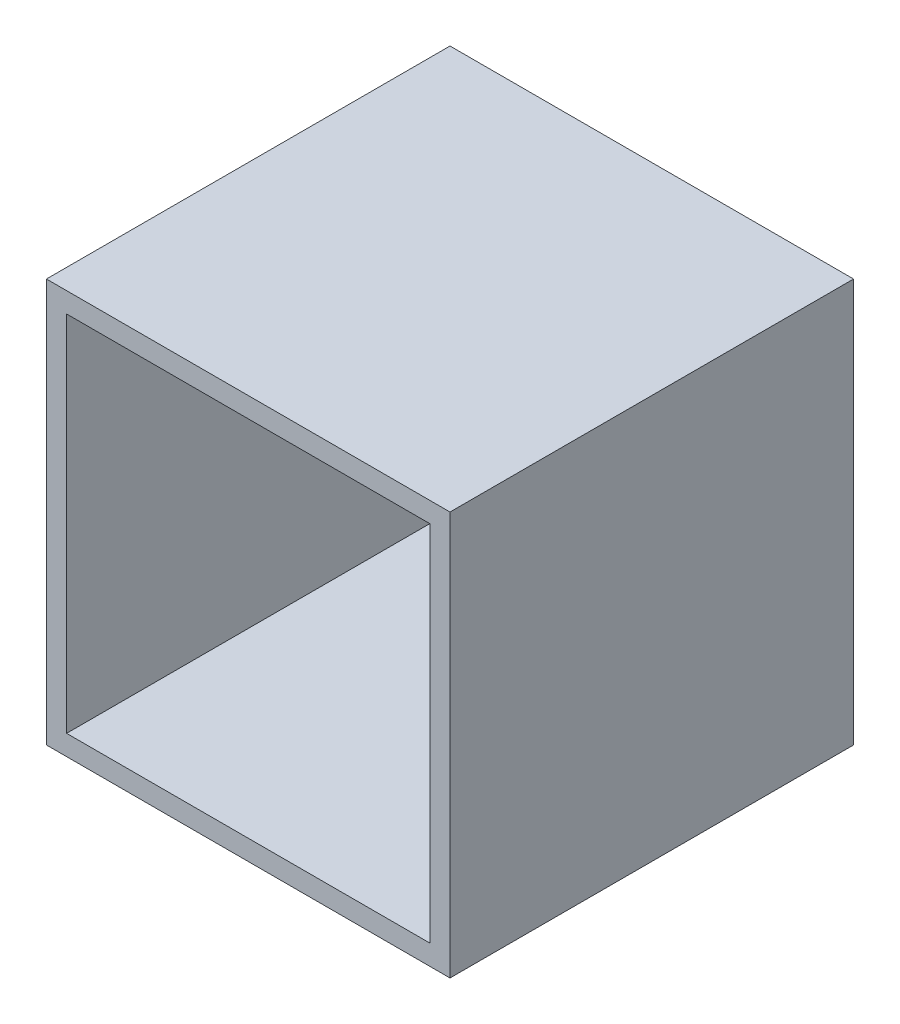
ISO-10303-21;
HEADER;
FILE_DESCRIPTION(('STEP AP214'),'2;1');
FILE_NAME('part.step','',(''),(''),'','','');
FILE_SCHEMA(('AUTOMOTIVE_DESIGN { 1 0 10303 214 1 1 1 1 }'));
ENDSEC;
DATA;
#1=APPLICATION_CONTEXT('core data for automotive mechanical design processes');
#2=APPLICATION_PROTOCOL_DEFINITION('international standard','automotive_design',2000,#1);
#3=PRODUCT_CONTEXT('',#1,'mechanical');
#4=PRODUCT('Part','Part','',(#3));
#5=PRODUCT_RELATED_PRODUCT_CATEGORY('part','',(#4));
#6=PRODUCT_DEFINITION_FORMATION('','',#4);
#7=PRODUCT_DEFINITION_CONTEXT('part definition',#1,'design');
#8=PRODUCT_DEFINITION('design','',#6,#7);
#9=PRODUCT_DEFINITION_SHAPE('','',#8);
#10=(LENGTH_UNIT() NAMED_UNIT(*) SI_UNIT(.MILLI.,.METRE.));
#11=(NAMED_UNIT(*) PLANE_ANGLE_UNIT() SI_UNIT($,.RADIAN.));
#12=(NAMED_UNIT(*) SI_UNIT($,.STERADIAN.) SOLID_ANGLE_UNIT());
#13=UNCERTAINTY_MEASURE_WITH_UNIT(LENGTH_MEASURE(1.E-05),#10,'distance_accuracy_value','');
#14=(GEOMETRIC_REPRESENTATION_CONTEXT(3) GLOBAL_UNCERTAINTY_ASSIGNED_CONTEXT((#13)) GLOBAL_UNIT_ASSIGNED_CONTEXT((#10,
#11,#12)) REPRESENTATION_CONTEXT('',''));
#15=CARTESIAN_POINT('',(0.,0.,0.));
#16=DIRECTION('',(0.,0.,1.));
#17=DIRECTION('',(1.,0.,0.));
#18=AXIS2_PLACEMENT_3D('',#15,#16,#17);
#19=CARTESIAN_POINT('',(-48.1313131313131,27.2727272727273,100.));
#20=DIRECTION('',(1.,0.,0.));
#21=DIRECTION('',(0.,1.,0.));
#22=AXIS2_PLACEMENT_3D('',#19,#20,#21);
#23=PLANE('',#22);
#24=DIRECTION('',(0.,-1.,0.));
#25=VECTOR('',#24,1.);
#26=CARTESIAN_POINT('',(-48.1313131313131,27.2727272727273,0.));
#27=LINE('',#26,#25);
#28=CARTESIAN_POINT('',(-48.1313131313131,27.2727272727273,0.));
#29=VERTEX_POINT('',#28);
#30=CARTESIAN_POINT('',(-48.1313131313131,-72.7272727272727,0.));
#31=VERTEX_POINT('',#30);
#32=EDGE_CURVE('E156',#29,#31,#27,.T.);
#33=ORIENTED_EDGE('',*,*,#32,.T.);
#34=DIRECTION('',(0.,0.,-1.));
#35=VECTOR('',#34,1.);
#36=CARTESIAN_POINT('',(-48.1313131313131,-72.7272727272727,100.));
#37=LINE('',#36,#35);
#38=CARTESIAN_POINT('',(-48.1313131313131,-72.7272727272727,100.));
#39=VERTEX_POINT('',#38);
#40=EDGE_CURVE('E11',#39,#31,#37,.T.);
#41=ORIENTED_EDGE('',*,*,#40,.F.);
#42=DIRECTION('',(0.,-1.,0.));
#43=VECTOR('',#42,1.);
#44=CARTESIAN_POINT('',(-48.1313131313131,27.2727272727273,100.));
#45=LINE('',#44,#43);
#46=CARTESIAN_POINT('',(-48.1313131313131,27.2727272727273,100.));
#47=VERTEX_POINT('',#46);
#48=EDGE_CURVE('E147',#47,#39,#45,.T.);
#49=ORIENTED_EDGE('',*,*,#48,.F.);
#50=DIRECTION('',(0.,0.,-1.));
#51=VECTOR('',#50,1.);
#52=CARTESIAN_POINT('',(-48.1313131313131,27.2727272727273,100.));
#53=LINE('',#52,#51);
#54=EDGE_CURVE('E62',#47,#29,#53,.T.);
#55=ORIENTED_EDGE('',*,*,#54,.T.);
#56=EDGE_LOOP('',(#33,#41,#49,#55));
#57=FACE_BOUND('',#56,.T.);
#58=ADVANCED_FACE('F39',(#57),#23,.F.);
#59=CARTESIAN_POINT('',(-48.1313131313131,-72.7272727272727,100.));
#60=DIRECTION('',(0.,1.,0.));
#61=DIRECTION('',(0.,0.,1.));
#62=AXIS2_PLACEMENT_3D('',#59,#60,#61);
#63=PLANE('',#62);
#64=DIRECTION('',(1.,0.,0.));
#65=VECTOR('',#64,1.);
#66=CARTESIAN_POINT('',(-48.1313131313131,-72.7272727272727,0.));
#67=LINE('',#66,#65);
#68=CARTESIAN_POINT('',(51.8686868686869,-72.7272727272727,0.));
#69=VERTEX_POINT('',#68);
#70=EDGE_CURVE('E158',#31,#69,#67,.T.);
#71=ORIENTED_EDGE('',*,*,#70,.T.);
#72=DIRECTION('',(0.,0.,-1.));
#73=VECTOR('',#72,1.);
#74=CARTESIAN_POINT('',(51.8686868686869,-72.7272727272727,100.));
#75=LINE('',#74,#73);
#76=CARTESIAN_POINT('',(51.8686868686869,-72.7272727272727,100.));
#77=VERTEX_POINT('',#76);
#78=EDGE_CURVE('E46',#77,#69,#75,.T.);
#79=ORIENTED_EDGE('',*,*,#78,.F.);
#80=DIRECTION('',(1.,0.,0.));
#81=VECTOR('',#80,1.);
#82=CARTESIAN_POINT('',(-48.1313131313131,-72.7272727272727,100.));
#83=LINE('',#82,#81);
#84=EDGE_CURVE('E88',#39,#77,#83,.T.);
#85=ORIENTED_EDGE('',*,*,#84,.F.);
#86=ORIENTED_EDGE('',*,*,#40,.T.);
#87=EDGE_LOOP('',(#71,#79,#85,#86));
#88=FACE_BOUND('',#87,.T.);
#89=ADVANCED_FACE('F172',(#88),#63,.F.);
#90=CARTESIAN_POINT('',(51.8686868686869,27.2727272727273,100.));
#91=DIRECTION('',(1.,0.,0.));
#92=DIRECTION('',(0.,1.,0.));
#93=AXIS2_PLACEMENT_3D('',#90,#91,#92);
#94=PLANE('',#93);
#95=DIRECTION('',(0.,-1.,0.));
#96=VECTOR('',#95,1.);
#97=CARTESIAN_POINT('',(51.8686868686869,27.2727272727273,0.));
#98=LINE('',#97,#96);
#99=CARTESIAN_POINT('',(51.8686868686869,27.2727272727273,0.));
#100=VERTEX_POINT('',#99);
#101=EDGE_CURVE('E161',#100,#69,#98,.T.);
#102=ORIENTED_EDGE('',*,*,#101,.F.);
#103=DIRECTION('',(0.,0.,-1.));
#104=VECTOR('',#103,1.);
#105=CARTESIAN_POINT('',(51.8686868686869,27.2727272727273,100.));
#106=LINE('',#105,#104);
#107=CARTESIAN_POINT('',(51.8686868686869,27.2727272727273,100.));
#108=VERTEX_POINT('',#107);
#109=EDGE_CURVE('E167',#108,#100,#106,.T.);
#110=ORIENTED_EDGE('',*,*,#109,.F.);
#111=DIRECTION('',(0.,-1.,0.));
#112=VECTOR('',#111,1.);
#113=CARTESIAN_POINT('',(51.8686868686869,27.2727272727273,100.));
#114=LINE('',#113,#112);
#115=EDGE_CURVE('E151',#108,#77,#114,.T.);
#116=ORIENTED_EDGE('',*,*,#115,.T.);
#117=ORIENTED_EDGE('',*,*,#78,.T.);
#118=EDGE_LOOP('',(#102,#110,#116,#117));
#119=FACE_BOUND('',#118,.T.);
#120=ADVANCED_FACE('F170',(#119),#94,.T.);
#121=CARTESIAN_POINT('',(-48.1313131313131,27.2727272727273,100.));
#122=DIRECTION('',(0.,1.,0.));
#123=DIRECTION('',(0.,0.,1.));
#124=AXIS2_PLACEMENT_3D('',#121,#122,#123);
#125=PLANE('',#124);
#126=DIRECTION('',(1.,0.,0.));
#127=VECTOR('',#126,1.);
#128=CARTESIAN_POINT('',(-48.1313131313131,27.2727272727273,0.));
#129=LINE('',#128,#127);
#130=EDGE_CURVE('E149',#29,#100,#129,.T.);
#131=ORIENTED_EDGE('',*,*,#130,.F.);
#132=ORIENTED_EDGE('',*,*,#54,.F.);
#133=DIRECTION('',(1.,0.,0.));
#134=VECTOR('',#133,1.);
#135=CARTESIAN_POINT('',(-48.1313131313131,27.2727272727273,100.));
#136=LINE('',#135,#134);
#137=EDGE_CURVE('E154',#47,#108,#136,.T.);
#138=ORIENTED_EDGE('',*,*,#137,.T.);
#139=ORIENTED_EDGE('',*,*,#109,.T.);
#140=EDGE_LOOP('',(#131,#132,#138,#139));
#141=FACE_BOUND('',#140,.T.);
#142=ADVANCED_FACE('F176',(#141),#125,.T.);
#143=CARTESIAN_POINT('',(0.,0.,100.));
#144=DIRECTION('',(0.,0.,1.));
#145=DIRECTION('',(1.,0.,0.));
#146=AXIS2_PLACEMENT_3D('',#143,#144,#145);
#147=PLANE('',#146);
#148=DIRECTION('',(0.,-1.,0.));
#149=VECTOR('',#148,1.);
#150=CARTESIAN_POINT('',(-43.1313131313131,27.2727272727273,100.));
#151=LINE('',#150,#149);
#152=CARTESIAN_POINT('',(-43.1313131313131,22.2727272727273,100.));
#153=VERTEX_POINT('',#152);
#154=CARTESIAN_POINT('',(-43.1313131313131,-67.7272727272727,100.));
#155=VERTEX_POINT('',#154);
#156=EDGE_CURVE('E137',#153,#155,#151,.T.);
#157=ORIENTED_EDGE('',*,*,#156,.F.);
#158=DIRECTION('',(1.,0.,0.));
#159=VECTOR('',#158,1.);
#160=CARTESIAN_POINT('',(-48.1313131313131,22.2727272727273,100.));
#161=LINE('',#160,#159);
#162=CARTESIAN_POINT('',(46.8686868686869,22.2727272727273,100.));
#163=VERTEX_POINT('',#162);
#164=EDGE_CURVE('E118',#153,#163,#161,.T.);
#165=ORIENTED_EDGE('',*,*,#164,.T.);
#166=DIRECTION('',(0.,-1.,0.));
#167=VECTOR('',#166,1.);
#168=CARTESIAN_POINT('',(46.8686868686869,27.2727272727273,100.));
#169=LINE('',#168,#167);
#170=CARTESIAN_POINT('',(46.8686868686869,-67.7272727272727,100.));
#171=VERTEX_POINT('',#170);
#172=EDGE_CURVE('E53',#163,#171,#169,.T.);
#173=ORIENTED_EDGE('',*,*,#172,.T.);
#174=DIRECTION('',(1.,0.,0.));
#175=VECTOR('',#174,1.);
#176=CARTESIAN_POINT('',(-48.1313131313131,-67.7272727272727,100.));
#177=LINE('',#176,#175);
#178=EDGE_CURVE('E139',#155,#171,#177,.T.);
#179=ORIENTED_EDGE('',*,*,#178,.F.);
#180=EDGE_LOOP('',(#157,#165,#173,#179));
#181=FACE_BOUND('',#180,.T.);
#182=ORIENTED_EDGE('',*,*,#48,.T.);
#183=ORIENTED_EDGE('',*,*,#84,.T.);
#184=ORIENTED_EDGE('',*,*,#115,.F.);
#185=ORIENTED_EDGE('',*,*,#137,.F.);
#186=EDGE_LOOP('',(#182,#183,#184,#185));
#187=FACE_BOUND('',#186,.T.);
#188=ADVANCED_FACE('F179',(#181,#187),#147,.T.);
#189=CARTESIAN_POINT('',(0.,0.,0.));
#190=DIRECTION('',(0.,0.,1.));
#191=DIRECTION('',(1.,0.,0.));
#192=AXIS2_PLACEMENT_3D('',#189,#190,#191);
#193=PLANE('',#192);
#194=ORIENTED_EDGE('',*,*,#32,.F.);
#195=ORIENTED_EDGE('',*,*,#130,.T.);
#196=ORIENTED_EDGE('',*,*,#101,.T.);
#197=ORIENTED_EDGE('',*,*,#70,.F.);
#198=EDGE_LOOP('',(#194,#195,#196,#197));
#199=FACE_BOUND('',#198,.T.);
#200=ADVANCED_FACE('F175',(#199),#193,.F.);
#201=CARTESIAN_POINT('',(-43.1313131313131,27.2727272727273,100.));
#202=DIRECTION('',(1.,0.,0.));
#203=DIRECTION('',(0.,1.,0.));
#204=AXIS2_PLACEMENT_3D('',#201,#202,#203);
#205=PLANE('',#204);
#206=DIRECTION('',(0.,-1.,0.));
#207=VECTOR('',#206,1.);
#208=CARTESIAN_POINT('',(-43.1313131313131,27.2727272727273,5.));
#209=LINE('',#208,#207);
#210=CARTESIAN_POINT('',(-43.1313131313131,22.2727272727273,5.));
#211=VERTEX_POINT('',#210);
#212=CARTESIAN_POINT('',(-43.1313131313131,-67.7272727272727,5.));
#213=VERTEX_POINT('',#212);
#214=EDGE_CURVE('E125',#211,#213,#209,.T.);
#215=ORIENTED_EDGE('',*,*,#214,.F.);
#216=DIRECTION('',(0.,0.,-1.));
#217=VECTOR('',#216,1.);
#218=CARTESIAN_POINT('',(-43.1313131313131,22.2727272727273,100.));
#219=LINE('',#218,#217);
#220=EDGE_CURVE('E112',#153,#211,#219,.T.);
#221=ORIENTED_EDGE('',*,*,#220,.F.);
#222=ORIENTED_EDGE('',*,*,#156,.T.);
#223=DIRECTION('',(0.,0.,-1.));
#224=VECTOR('',#223,1.);
#225=CARTESIAN_POINT('',(-43.1313131313131,-67.7272727272727,100.));
#226=LINE('',#225,#224);
#227=EDGE_CURVE('E128',#155,#213,#226,.T.);
#228=ORIENTED_EDGE('',*,*,#227,.T.);
#229=EDGE_LOOP('',(#215,#221,#222,#228));
#230=FACE_BOUND('',#229,.T.);
#231=ADVANCED_FACE('F126',(#230),#205,.T.);
#232=CARTESIAN_POINT('',(-48.1313131313131,-67.7272727272727,100.));
#233=DIRECTION('',(0.,1.,0.));
#234=DIRECTION('',(0.,0.,1.));
#235=AXIS2_PLACEMENT_3D('',#232,#233,#234);
#236=PLANE('',#235);
#237=DIRECTION('',(1.,0.,0.));
#238=VECTOR('',#237,1.);
#239=CARTESIAN_POINT('',(-48.1313131313131,-67.7272727272727,5.));
#240=LINE('',#239,#238);
#241=CARTESIAN_POINT('',(46.8686868686869,-67.7272727272727,5.));
#242=VERTEX_POINT('',#241);
#243=EDGE_CURVE('E131',#213,#242,#240,.T.);
#244=ORIENTED_EDGE('',*,*,#243,.F.);
#245=ORIENTED_EDGE('',*,*,#227,.F.);
#246=ORIENTED_EDGE('',*,*,#178,.T.);
#247=DIRECTION('',(0.,0.,-1.));
#248=VECTOR('',#247,1.);
#249=CARTESIAN_POINT('',(46.8686868686869,-67.7272727272727,100.));
#250=LINE('',#249,#248);
#251=EDGE_CURVE('E271',#171,#242,#250,.T.);
#252=ORIENTED_EDGE('',*,*,#251,.T.);
#253=EDGE_LOOP('',(#244,#245,#246,#252));
#254=FACE_BOUND('',#253,.T.);
#255=ADVANCED_FACE('F203',(#254),#236,.T.);
#256=CARTESIAN_POINT('',(46.8686868686869,27.2727272727273,100.));
#257=DIRECTION('',(1.,0.,0.));
#258=DIRECTION('',(0.,1.,0.));
#259=AXIS2_PLACEMENT_3D('',#256,#257,#258);
#260=PLANE('',#259);
#261=DIRECTION('',(0.,-1.,0.));
#262=VECTOR('',#261,1.);
#263=CARTESIAN_POINT('',(46.8686868686869,27.2727272727273,5.));
#264=LINE('',#263,#262);
#265=CARTESIAN_POINT('',(46.8686868686869,22.2727272727273,5.));
#266=VERTEX_POINT('',#265);
#267=EDGE_CURVE('E136',#266,#242,#264,.T.);
#268=ORIENTED_EDGE('',*,*,#267,.T.);
#269=ORIENTED_EDGE('',*,*,#251,.F.);
#270=ORIENTED_EDGE('',*,*,#172,.F.);
#271=DIRECTION('',(0.,0.,-1.));
#272=VECTOR('',#271,1.);
#273=CARTESIAN_POINT('',(46.8686868686869,22.2727272727273,100.));
#274=LINE('',#273,#272);
#275=EDGE_CURVE('E121',#163,#266,#274,.T.);
#276=ORIENTED_EDGE('',*,*,#275,.T.);
#277=EDGE_LOOP('',(#268,#269,#270,#276));
#278=FACE_BOUND('',#277,.T.);
#279=ADVANCED_FACE('F200',(#278),#260,.F.);
#280=CARTESIAN_POINT('',(-48.1313131313131,22.2727272727273,100.));
#281=DIRECTION('',(0.,1.,0.));
#282=DIRECTION('',(0.,0.,1.));
#283=AXIS2_PLACEMENT_3D('',#280,#281,#282);
#284=PLANE('',#283);
#285=DIRECTION('',(1.,0.,0.));
#286=VECTOR('',#285,1.);
#287=CARTESIAN_POINT('',(-48.1313131313131,22.2727272727273,5.));
#288=LINE('',#287,#286);
#289=EDGE_CURVE('E116',#211,#266,#288,.T.);
#290=ORIENTED_EDGE('',*,*,#289,.T.);
#291=ORIENTED_EDGE('',*,*,#275,.F.);
#292=ORIENTED_EDGE('',*,*,#164,.F.);
#293=ORIENTED_EDGE('',*,*,#220,.T.);
#294=EDGE_LOOP('',(#290,#291,#292,#293));
#295=FACE_BOUND('',#294,.T.);
#296=ADVANCED_FACE('F114',(#295),#284,.F.);
#297=CARTESIAN_POINT('',(0.,0.,5.));
#298=DIRECTION('',(0.,0.,1.));
#299=DIRECTION('',(1.,0.,0.));
#300=AXIS2_PLACEMENT_3D('',#297,#298,#299);
#301=PLANE('',#300);
#302=ORIENTED_EDGE('',*,*,#214,.T.);
#303=ORIENTED_EDGE('',*,*,#243,.T.);
#304=ORIENTED_EDGE('',*,*,#267,.F.);
#305=ORIENTED_EDGE('',*,*,#289,.F.);
#306=EDGE_LOOP('',(#302,#303,#304,#305));
#307=FACE_BOUND('',#306,.T.);
#308=ADVANCED_FACE('F134',(#307),#301,.T.);
#309=CLOSED_SHELL('',(#58,#89,#120,#142,#188,#200,#231,#255,#279,#296,#308));
#310=MANIFOLD_SOLID_BREP('B2',#309);
#311=ADVANCED_BREP_SHAPE_REPRESENTATION('',(#18,#310),#14);
#312=SHAPE_DEFINITION_REPRESENTATION(#9,#311);
ENDSEC;
END-ISO-10303-21;
